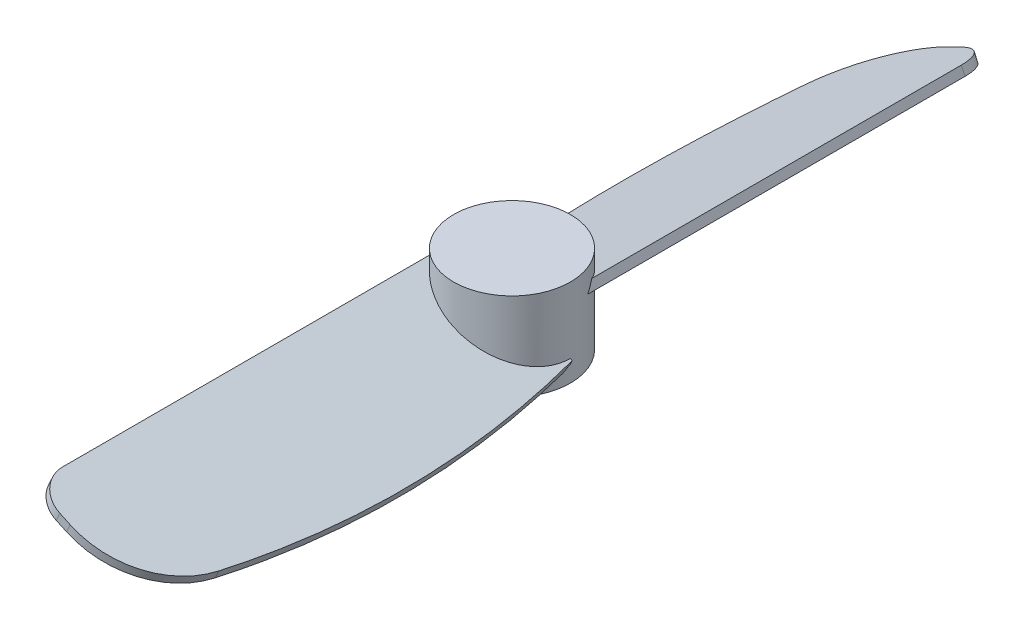
ISO-10303-21;
HEADER;
FILE_DESCRIPTION(('STEP AP214'),'2;1');
FILE_NAME('part.step','',(''),(''),'','','');
FILE_SCHEMA(('AUTOMOTIVE_DESIGN { 1 0 10303 214 1 1 1 1 }'));
ENDSEC;
DATA;
#1=APPLICATION_CONTEXT('core data for automotive mechanical design processes');
#2=APPLICATION_PROTOCOL_DEFINITION('international standard','automotive_design',2000,#1);
#3=PRODUCT_CONTEXT('',#1,'mechanical');
#4=PRODUCT('Part','Part','',(#3));
#5=PRODUCT_RELATED_PRODUCT_CATEGORY('part','',(#4));
#6=PRODUCT_DEFINITION_FORMATION('','',#4);
#7=PRODUCT_DEFINITION_CONTEXT('part definition',#1,'design');
#8=PRODUCT_DEFINITION('design','',#6,#7);
#9=PRODUCT_DEFINITION_SHAPE('','',#8);
#10=(LENGTH_UNIT() NAMED_UNIT(*) SI_UNIT(.MILLI.,.METRE.));
#11=(NAMED_UNIT(*) PLANE_ANGLE_UNIT() SI_UNIT($,.RADIAN.));
#12=(NAMED_UNIT(*) SI_UNIT($,.STERADIAN.) SOLID_ANGLE_UNIT());
#13=UNCERTAINTY_MEASURE_WITH_UNIT(LENGTH_MEASURE(1.E-05),#10,'distance_accuracy_value','');
#14=(GEOMETRIC_REPRESENTATION_CONTEXT(3) GLOBAL_UNCERTAINTY_ASSIGNED_CONTEXT((#13)) GLOBAL_UNIT_ASSIGNED_CONTEXT((#10,
#11,#12)) REPRESENTATION_CONTEXT('',''));
#15=CARTESIAN_POINT('',(0.,0.,0.));
#16=DIRECTION('',(0.,0.,1.));
#17=DIRECTION('',(1.,0.,0.));
#18=AXIS2_PLACEMENT_3D('',#15,#16,#17);
#19=CARTESIAN_POINT('',(0.,3.,0.));
#20=DIRECTION('',(0.,-1.,0.));
#21=DIRECTION('',(0.,0.,-1.));
#22=AXIS2_PLACEMENT_3D('',#19,#20,#21);
#23=CYLINDRICAL_SURFACE('',#22,2.);
#24=CARTESIAN_POINT('',(0.,1.33449331215563,0.));
#25=DIRECTION('',(0.4226182617407,0.90630778703665,0.));
#26=DIRECTION('',(0.90630778703665,-0.4226182617407,0.));
#27=AXIS2_PLACEMENT_3D('',#24,#25,#26);
#28=ELLIPSE('',#27,2.20675583792498,2.);
#29=CARTESIAN_POINT('',(-1.86168060041287,2.20260923316675,0.730852476253843));
#30=VERTEX_POINT('',#29);
#31=CARTESIAN_POINT('',(1.98470099898247,0.409012037182223,0.246904727856673));
#32=VERTEX_POINT('',#31);
#33=EDGE_CURVE('E214',#30,#32,#28,.T.);
#34=ORIENTED_EDGE('',*,*,#33,.F.);
#35=CARTESIAN_POINT('',(0.,6.19499616453053,0.));
#36=DIRECTION('',(0.90630778703665,-0.4226182617407,0.));
#37=DIRECTION('',(-0.4226182617407,-0.90630778703665,0.));
#38=AXIS2_PLACEMENT_3D('',#35,#36,#37);
#39=ELLIPSE('',#38,4.73240316630499,2.);
#40=CARTESIAN_POINT('',(-1.73489512189066,2.47450156927774,0.99505724259461));
#41=VERTEX_POINT('',#40);
#42=EDGE_CURVE('E215',#41,#30,#39,.T.);
#43=ORIENTED_EDGE('',*,*,#42,.F.);
#44=CARTESIAN_POINT('',(0.,1.66550668784437,0.));
#45=DIRECTION('',(0.4226182617407,0.90630778703665,0.));
#46=DIRECTION('',(0.90630778703665,-0.4226182617407,0.));
#47=AXIS2_PLACEMENT_3D('',#44,#45,#46);
#48=ELLIPSE('',#47,2.20675583792498,2.);
#49=CARTESIAN_POINT('',(2.,0.732891371534376,0.));
#50=VERTEX_POINT('',#49);
#51=EDGE_CURVE('E336',#41,#50,#48,.T.);
#52=ORIENTED_EDGE('',*,*,#51,.T.);
#53=DIRECTION('',(0.,-1.,0.));
#54=VECTOR('',#53,1.);
#55=CARTESIAN_POINT('',(2.,3.,0.));
#56=LINE('',#55,#54);
#57=CARTESIAN_POINT('',(2.,0.567384683689995,0.));
#58=VERTEX_POINT('',#57);
#59=EDGE_CURVE('E344',#58,#50,#56,.F.);
#60=ORIENTED_EDGE('',*,*,#59,.F.);
#61=CARTESIAN_POINT('',(1.98470099898247,0.409012037182223,0.246904727856674));
#62=CARTESIAN_POINT('',(1.98631074920114,0.418913709083716,0.233964098973606));
#63=CARTESIAN_POINT('',(1.98780866004074,0.428662089758854,0.220891180027441));
#64=CARTESIAN_POINT('',(1.99056346456721,0.447804826228146,0.194506507014765));
#65=CARTESIAN_POINT('',(1.9918208621833,0.457199888348943,0.181195317663848));
#66=CARTESIAN_POINT('',(1.99408290423281,0.475619821167752,0.154320949026741));
#67=CARTESIAN_POINT('',(1.9950878461475,0.484645116979881,0.140758086739075));
#68=CARTESIAN_POINT('',(1.99683182681587,0.502308906882166,0.113362602381722));
#69=CARTESIAN_POINT('',(1.99757082274567,0.510947338481707,0.0995299372448104));
#70=CARTESIAN_POINT('',(1.99876750219999,0.52781267297241,0.0715840387397662));
#71=CARTESIAN_POINT('',(1.99922489678712,0.536039145250494,0.0574705324864369));
#72=CARTESIAN_POINT('',(1.999841469295,0.552054847776113,0.0289482186682646));
#73=CARTESIAN_POINT('',(1.99999995161736,0.559843017327442,0.0145388009944491));
#74=CARTESIAN_POINT('',(2.,0.567384683689995,0.));
#75=B_SPLINE_CURVE_WITH_KNOTS('',3,(#61,#62,#63,#64,#65,#66,#67,#68,#69,#70,#71,#72,#73,#74),
.UNSPECIFIED.,.F.,.F.,(4,2,2,2,2,2,4),(0.,0.0491203850535244,0.0981366966215064,
0.147094975976519,0.19606113530196,0.245077453044183,0.294207696537932),.UNSPECIFIED.);
#76=EDGE_CURVE('E206',#32,#58,#75,.T.);
#77=ORIENTED_EDGE('',*,*,#76,.F.);
#78=EDGE_LOOP('',(#34,#43,#52,#60,#77));
#79=FACE_BOUND('',#78,.T.);
#80=CARTESIAN_POINT('',(0.,3.,0.));
#81=DIRECTION('',(0.,1.,0.));
#82=DIRECTION('',(0.,0.,1.));
#83=AXIS2_PLACEMENT_3D('',#80,#81,#82);
#84=CIRCLE('',#83,2.);
#85=CARTESIAN_POINT('',(0.,3.,2.));
#86=VERTEX_POINT('',#85);
#87=EDGE_CURVE('E326',#86,#86,#84,.T.);
#88=ORIENTED_EDGE('',*,*,#87,.F.);
#89=EDGE_LOOP('',(#88));
#90=FACE_BOUND('',#89,.T.);
#91=CARTESIAN_POINT('',(0.,0.,0.));
#92=DIRECTION('',(0.,1.,0.));
#93=DIRECTION('',(0.,0.,1.));
#94=AXIS2_PLACEMENT_3D('',#91,#92,#93);
#95=CIRCLE('',#94,2.);
#96=CARTESIAN_POINT('',(0.,0.,2.));
#97=VERTEX_POINT('',#96);
#98=EDGE_CURVE('E329',#97,#97,#95,.T.);
#99=ORIENTED_EDGE('',*,*,#98,.T.);
#100=EDGE_LOOP('',(#99));
#101=FACE_BOUND('',#100,.T.);
#102=CARTESIAN_POINT('',(0.,1.33449331215563,0.));
#103=DIRECTION('',(-0.4226182617407,0.90630778703665,0.));
#104=DIRECTION('',(-0.90630778703665,-0.4226182617407,0.));
#105=AXIS2_PLACEMENT_3D('',#102,#103,#104);
#106=ELLIPSE('',#105,2.20675583792498,2.);
#107=CARTESIAN_POINT('',(1.86168060041287,2.20260923316675,-0.730852476253843));
#108=VERTEX_POINT('',#107);
#109=CARTESIAN_POINT('',(-1.98470099898247,0.409012037182223,-0.246904727856673));
#110=VERTEX_POINT('',#109);
#111=EDGE_CURVE('E11',#108,#110,#106,.T.);
#112=ORIENTED_EDGE('',*,*,#111,.F.);
#113=CARTESIAN_POINT('',(0.,6.19499616453053,0.));
#114=DIRECTION('',(-0.90630778703665,-0.4226182617407,0.));
#115=DIRECTION('',(0.4226182617407,-0.90630778703665,0.));
#116=AXIS2_PLACEMENT_3D('',#113,#114,#115);
#117=ELLIPSE('',#116,4.73240316630499,2.);
#118=CARTESIAN_POINT('',(1.73489512189066,2.47450156927774,-0.99505724259461));
#119=VERTEX_POINT('',#118);
#120=EDGE_CURVE('E226',#119,#108,#117,.T.);
#121=ORIENTED_EDGE('',*,*,#120,.F.);
#122=CARTESIAN_POINT('',(0.,1.66550668784437,0.));
#123=DIRECTION('',(-0.4226182617407,0.90630778703665,0.));
#124=DIRECTION('',(-0.90630778703665,-0.4226182617407,0.));
#125=AXIS2_PLACEMENT_3D('',#122,#123,#124);
#126=ELLIPSE('',#125,2.20675583792498,2.);
#127=CARTESIAN_POINT('',(-2.,0.732891371534376,0.));
#128=VERTEX_POINT('',#127);
#129=EDGE_CURVE('E219',#119,#128,#126,.T.);
#130=ORIENTED_EDGE('',*,*,#129,.T.);
#131=DIRECTION('',(0.,-1.,0.));
#132=VECTOR('',#131,1.);
#133=CARTESIAN_POINT('',(-2.,3.,0.));
#134=LINE('',#133,#132);
#135=CARTESIAN_POINT('',(-2.,0.567384683689995,0.));
#136=VERTEX_POINT('',#135);
#137=EDGE_CURVE('E223',#136,#128,#134,.F.);
#138=ORIENTED_EDGE('',*,*,#137,.F.);
#139=CARTESIAN_POINT('',(-1.98470099898247,0.409012037182223,-0.246904727856674));
#140=CARTESIAN_POINT('',(-1.98631074920114,0.418913709083716,-0.233964098973606));
#141=CARTESIAN_POINT('',(-1.98780866004074,0.428662089758854,-0.220891180027441));
#142=CARTESIAN_POINT('',(-1.99056346456721,0.447804826228146,-0.194506507014765));
#143=CARTESIAN_POINT('',(-1.9918208621833,0.457199888348943,-0.181195317663848));
#144=CARTESIAN_POINT('',(-1.99408290423281,0.475619821167752,-0.154320949026741));
#145=CARTESIAN_POINT('',(-1.9950878461475,0.484645116979881,-0.140758086739075));
#146=CARTESIAN_POINT('',(-1.99683182681587,0.502308906882166,-0.113362602381722));
#147=CARTESIAN_POINT('',(-1.99757082274567,0.510947338481707,-0.0995299372448104));
#148=CARTESIAN_POINT('',(-1.99876750219999,0.52781267297241,-0.0715840387397662));
#149=CARTESIAN_POINT('',(-1.99922489678712,0.536039145250494,-0.0574705324864369));
#150=CARTESIAN_POINT('',(-1.999841469295,0.552054847776113,-0.0289482186682646));
#151=CARTESIAN_POINT('',(-1.99999995161736,0.559843017327442,-0.0145388009944491));
#152=CARTESIAN_POINT('',(-2.,0.567384683689995,0.));
#153=B_SPLINE_CURVE_WITH_KNOTS('',3,(#139,#140,#141,#142,#143,#144,#145,#146,#147,#148,#149,
#150,#151,#152),.UNSPECIFIED.,.F.,.F.,(4,2,2,2,2,2,4),(0.,0.0491203850535244,0.0981366966215064,
0.147094975976519,0.19606113530196,0.245077453044183,0.294207696537932),.UNSPECIFIED.);
#154=EDGE_CURVE('E52',#110,#136,#153,.T.);
#155=ORIENTED_EDGE('',*,*,#154,.F.);
#156=EDGE_LOOP('',(#112,#121,#130,#138,#155));
#157=FACE_BOUND('',#156,.T.);
#158=ADVANCED_FACE('F43',(#79,#90,#101,#157),#23,.T.);
#159=CARTESIAN_POINT('',(0.,3.,0.));
#160=DIRECTION('',(0.,1.,0.));
#161=DIRECTION('',(0.,0.,1.));
#162=AXIS2_PLACEMENT_3D('',#159,#160,#161);
#163=PLANE('',#162);
#164=ORIENTED_EDGE('',*,*,#87,.T.);
#165=EDGE_LOOP('',(#164));
#166=FACE_BOUND('',#165,.T.);
#167=ADVANCED_FACE('F204',(#166),#163,.T.);
#168=CARTESIAN_POINT('',(0.,0.,0.));
#169=DIRECTION('',(0.,1.,0.));
#170=DIRECTION('',(0.,0.,1.));
#171=AXIS2_PLACEMENT_3D('',#168,#169,#170);
#172=PLANE('',#171);
#173=ORIENTED_EDGE('',*,*,#98,.F.);
#174=EDGE_LOOP('',(#173));
#175=FACE_BOUND('',#174,.T.);
#176=ADVANCED_FACE('F200',(#175),#172,.F.);
#177=CARTESIAN_POINT('',(1.9366072607389,0.431438515634503,0.));
#178=CARTESIAN_POINT('',(2.74310536573246,0.0553622729885107,4.05925916805056));
#179=CARTESIAN_POINT('',(2.78270618295463,0.0368961086486167,8.18706439425503));
#180=CARTESIAN_POINT('',(2.06446844732065,0.371815865150648,12.2227826917002));
#181=B_SPLINE_CURVE_WITH_KNOTS('',3,(#177,#178,#179,#180),.UNSPECIFIED.,.F.,.F.,(4,4),(0.,
0.833038136070243),.UNSPECIFIED.);
#182=DIRECTION('',(0.4226182617407,0.90630778703665,0.));
#183=VECTOR('',#182,1.);
#184=SURFACE_OF_LINEAR_EXTRUSION('',#181,#183);
#185=CARTESIAN_POINT('',(2.06446844732065,0.371815865150648,12.2227826917002));
#186=VERTEX_POINT('',#185);
#187=EDGE_CURVE('E182',#32,#186,#181,.T.);
#188=ORIENTED_EDGE('',*,*,#187,.F.);
#189=ORIENTED_EDGE('',*,*,#76,.T.);
#190=DIRECTION('',(0.4226182617407,0.90630778703665,0.));
#191=VECTOR('',#190,1.);
#192=CARTESIAN_POINT('',(1.9366072607389,0.431438515634503,0.));
#193=LINE('',#192,#191);
#194=CARTESIAN_POINT('',(2.06339273926111,0.703330851745498,0.));
#195=VERTEX_POINT('',#194);
#196=EDGE_CURVE('E365',#58,#195,#193,.T.);
#197=ORIENTED_EDGE('',*,*,#196,.T.);
#198=CARTESIAN_POINT('',(2.06339273926111,0.703330851745498,0.));
#199=CARTESIAN_POINT('',(2.86989084425467,0.327254609099506,4.05925916805056));
#200=CARTESIAN_POINT('',(2.90949166147684,0.308788444759612,8.18706439425503));
#201=CARTESIAN_POINT('',(2.19125392584286,0.643708201261643,12.2227826917002));
#202=B_SPLINE_CURVE_WITH_KNOTS('',3,(#198,#199,#200,#201),.UNSPECIFIED.,.F.,.F.,(4,4),(0.,
0.833038136070243),.UNSPECIFIED.);
#203=CARTESIAN_POINT('',(2.19125392584286,0.643708201261643,12.2227826917002));
#204=VERTEX_POINT('',#203);
#205=EDGE_CURVE('E171',#195,#204,#202,.T.);
#206=ORIENTED_EDGE('',*,*,#205,.T.);
#207=DIRECTION('',(0.4226182617407,0.90630778703665,0.));
#208=VECTOR('',#207,1.);
#209=CARTESIAN_POINT('',(2.06446844732065,0.371815865150648,12.2227826917002));
#210=LINE('',#209,#208);
#211=EDGE_CURVE('E332',#186,#204,#210,.T.);
#212=ORIENTED_EDGE('',*,*,#211,.F.);
#213=EDGE_LOOP('',(#188,#189,#197,#206,#212));
#214=FACE_BOUND('',#213,.T.);
#215=ADVANCED_FACE('F194',(#214),#184,.F.);
#216=CARTESIAN_POINT('',(-1.14374465748212,1.86783020491341,0.));
#217=DIRECTION('',(0.,0.,1.));
#218=DIRECTION('',(1.,0.,0.));
#219=AXIS2_PLACEMENT_3D('',#216,#217,#218);
#220=PLANE('',#219);
#221=ORIENTED_EDGE('',*,*,#196,.F.);
#222=ORIENTED_EDGE('',*,*,#59,.T.);
#223=DIRECTION('',(0.90630778703665,-0.4226182617407,0.));
#224=VECTOR('',#223,1.);
#225=CARTESIAN_POINT('',(-1.01695917895991,2.1397225410244,0.));
#226=LINE('',#225,#224);
#227=EDGE_CURVE('E67',#50,#195,#226,.T.);
#228=ORIENTED_EDGE('',*,*,#227,.T.);
#229=EDGE_LOOP('',(#221,#222,#228));
#230=FACE_BOUND('',#229,.T.);
#231=ADVANCED_FACE('F199',(#230),#220,.F.);
#232=CARTESIAN_POINT('',(-0.603502237511158,1.61591102722076,11.6447172519861));
#233=DIRECTION('',(0.4226182617407,0.90630778703665,0.));
#234=DIRECTION('',(-0.90630778703665,0.4226182617407,0.));
#235=AXIS2_PLACEMENT_3D('',#232,#233,#234);
#236=CYLINDRICAL_SURFACE('',#235,3.);
#237=CARTESIAN_POINT('',(-0.476716758988948,1.88780336333175,11.6447172519861));
#238=DIRECTION('',(-0.4226182617407,-0.90630778703665,0.));
#239=DIRECTION('',(0.90630778703665,-0.4226182617407,0.));
#240=AXIS2_PLACEMENT_3D('',#237,#238,#239);
#241=CIRCLE('',#240,3.);
#242=CARTESIAN_POINT('',(-0.476716758988949,1.88780336333175,14.6447172519861));
#243=VERTEX_POINT('',#242);
#244=EDGE_CURVE('E176',#204,#243,#241,.T.);
#245=ORIENTED_EDGE('',*,*,#244,.T.);
#246=DIRECTION('',(0.4226182617407,0.90630778703665,0.));
#247=VECTOR('',#246,1.);
#248=CARTESIAN_POINT('',(-0.603502237511159,1.61591102722076,14.6447172519861));
#249=LINE('',#248,#247);
#250=CARTESIAN_POINT('',(-0.603502237511159,1.61591102722076,14.6447172519861));
#251=VERTEX_POINT('',#250);
#252=EDGE_CURVE('E339',#251,#243,#249,.T.);
#253=ORIENTED_EDGE('',*,*,#252,.F.);
#254=CARTESIAN_POINT('',(-0.603502237511158,1.61591102722076,11.6447172519861));
#255=DIRECTION('',(-0.4226182617407,-0.90630778703665,0.));
#256=DIRECTION('',(0.90630778703665,-0.4226182617407,0.));
#257=AXIS2_PLACEMENT_3D('',#254,#255,#256);
#258=CIRCLE('',#257,3.);
#259=EDGE_CURVE('E188',#186,#251,#258,.T.);
#260=ORIENTED_EDGE('',*,*,#259,.F.);
#261=ORIENTED_EDGE('',*,*,#211,.T.);
#262=EDGE_LOOP('',(#245,#253,#260,#261));
#263=FACE_BOUND('',#262,.T.);
#264=ADVANCED_FACE('F202',(#263),#236,.T.);
#265=CARTESIAN_POINT('',(-0.955372813376221,1.77999097142605,14.6447172519861));
#266=DIRECTION('',(0.,0.,-1.));
#267=DIRECTION('',(-1.,0.,0.));
#268=AXIS2_PLACEMENT_3D('',#265,#266,#267);
#269=PLANE('',#268);
#270=DIRECTION('',(-0.906307787036649,0.4226182617407,0.));
#271=VECTOR('',#270,1.);
#272=CARTESIAN_POINT('',(-0.828587334854011,2.05188330753704,14.6447172519861));
#273=LINE('',#272,#271);
#274=CARTESIAN_POINT('',(-0.828587334854011,2.05188330753704,14.6447172519861));
#275=VERTEX_POINT('',#274);
#276=EDGE_CURVE('E381',#243,#275,#273,.T.);
#277=ORIENTED_EDGE('',*,*,#276,.T.);
#278=DIRECTION('',(0.4226182617407,0.90630778703665,0.));
#279=VECTOR('',#278,1.);
#280=CARTESIAN_POINT('',(-0.955372813376221,1.77999097142605,14.6447172519861));
#281=LINE('',#280,#279);
#282=CARTESIAN_POINT('',(-0.955372813376221,1.77999097142605,14.6447172519861));
#283=VERTEX_POINT('',#282);
#284=EDGE_CURVE('E393',#283,#275,#281,.T.);
#285=ORIENTED_EDGE('',*,*,#284,.F.);
#286=DIRECTION('',(-0.906307787036649,0.4226182617407,0.));
#287=VECTOR('',#286,1.);
#288=CARTESIAN_POINT('',(-0.955372813376221,1.77999097142605,14.6447172519861));
#289=LINE('',#288,#287);
#290=EDGE_CURVE('E371',#251,#283,#289,.T.);
#291=ORIENTED_EDGE('',*,*,#290,.F.);
#292=ORIENTED_EDGE('',*,*,#252,.T.);
#293=EDGE_LOOP('',(#277,#285,#291,#292));
#294=FACE_BOUND('',#293,.T.);
#295=ADVANCED_FACE('F403',(#294),#269,.F.);
#296=CARTESIAN_POINT('',(-0.955372813376221,1.77999097142605,13.6447172519861));
#297=DIRECTION('',(0.4226182617407,0.90630778703665,0.));
#298=DIRECTION('',(-0.90630778703665,0.4226182617407,0.));
#299=AXIS2_PLACEMENT_3D('',#296,#297,#298);
#300=CYLINDRICAL_SURFACE('',#299,1.);
#301=CARTESIAN_POINT('',(-0.828587334854011,2.05188330753704,13.6447172519861));
#302=DIRECTION('',(-0.4226182617407,-0.90630778703665,0.));
#303=DIRECTION('',(-0.90630778703665,0.4226182617407,0.));
#304=AXIS2_PLACEMENT_3D('',#301,#302,#303);
#305=CIRCLE('',#304,1.);
#306=CARTESIAN_POINT('',(-1.73489512189066,2.47450156927774,13.6447172519861));
#307=VERTEX_POINT('',#306);
#308=EDGE_CURVE('E384',#275,#307,#305,.T.);
#309=ORIENTED_EDGE('',*,*,#308,.T.);
#310=DIRECTION('',(0.4226182617407,0.90630778703665,0.));
#311=VECTOR('',#310,1.);
#312=CARTESIAN_POINT('',(-1.86168060041287,2.20260923316675,13.6447172519861));
#313=LINE('',#312,#311);
#314=CARTESIAN_POINT('',(-1.86168060041287,2.20260923316675,13.6447172519861));
#315=VERTEX_POINT('',#314);
#316=EDGE_CURVE('E369',#315,#307,#313,.T.);
#317=ORIENTED_EDGE('',*,*,#316,.F.);
#318=CARTESIAN_POINT('',(-0.955372813376221,1.77999097142605,13.6447172519861));
#319=DIRECTION('',(-0.4226182617407,-0.90630778703665,0.));
#320=DIRECTION('',(-0.90630778703665,0.4226182617407,0.));
#321=AXIS2_PLACEMENT_3D('',#318,#319,#320);
#322=CIRCLE('',#321,1.);
#323=EDGE_CURVE('E362',#283,#315,#322,.T.);
#324=ORIENTED_EDGE('',*,*,#323,.F.);
#325=ORIENTED_EDGE('',*,*,#284,.T.);
#326=EDGE_LOOP('',(#309,#317,#324,#325));
#327=FACE_BOUND('',#326,.T.);
#328=ADVANCED_FACE('F409',(#327),#300,.T.);
#329=CARTESIAN_POINT('',(-1.86168060041287,2.20260923316675,0.610320394620634));
#330=DIRECTION('',(0.90630778703665,-0.4226182617407,0.));
#331=DIRECTION('',(0.4226182617407,0.90630778703665,0.));
#332=AXIS2_PLACEMENT_3D('',#329,#330,#331);
#333=PLANE('',#332);
#334=DIRECTION('',(0.,0.,-1.));
#335=VECTOR('',#334,1.);
#336=CARTESIAN_POINT('',(-1.73489512189066,2.47450156927774,0.610320394620634));
#337=LINE('',#336,#335);
#338=EDGE_CURVE('E358',#307,#41,#337,.T.);
#339=ORIENTED_EDGE('',*,*,#338,.T.);
#340=ORIENTED_EDGE('',*,*,#42,.T.);
#341=DIRECTION('',(0.,0.,-1.));
#342=VECTOR('',#341,1.);
#343=CARTESIAN_POINT('',(-1.86168060041287,2.20260923316675,0.610320394620634));
#344=LINE('',#343,#342);
#345=EDGE_CURVE('E356',#315,#30,#344,.T.);
#346=ORIENTED_EDGE('',*,*,#345,.F.);
#347=ORIENTED_EDGE('',*,*,#316,.T.);
#348=EDGE_LOOP('',(#339,#340,#346,#347));
#349=FACE_BOUND('',#348,.T.);
#350=ADVANCED_FACE('F354',(#349),#333,.F.);
#351=CARTESIAN_POINT('',(2.5723137942651,0.135003690712067,6.12021917232712));
#352=DIRECTION('',(0.4226182617407,0.90630778703665,0.));
#353=DIRECTION('',(-0.90630778703665,0.4226182617407,0.));
#354=AXIS2_PLACEMENT_3D('',#351,#352,#353);
#355=PLANE('',#354);
#356=ORIENTED_EDGE('',*,*,#345,.T.);
#357=ORIENTED_EDGE('',*,*,#33,.T.);
#358=ORIENTED_EDGE('',*,*,#187,.T.);
#359=ORIENTED_EDGE('',*,*,#259,.T.);
#360=ORIENTED_EDGE('',*,*,#290,.T.);
#361=ORIENTED_EDGE('',*,*,#323,.T.);
#362=EDGE_LOOP('',(#356,#357,#358,#359,#360,#361));
#363=FACE_BOUND('',#362,.T.);
#364=ADVANCED_FACE('F241',(#363),#355,.F.);
#365=CARTESIAN_POINT('',(2.69909927278731,0.406896026823062,6.12021917232712));
#366=DIRECTION('',(0.4226182617407,0.90630778703665,0.));
#367=DIRECTION('',(-0.90630778703665,0.4226182617407,0.));
#368=AXIS2_PLACEMENT_3D('',#365,#366,#367);
#369=PLANE('',#368);
#370=ORIENTED_EDGE('',*,*,#51,.F.);
#371=ORIENTED_EDGE('',*,*,#338,.F.);
#372=ORIENTED_EDGE('',*,*,#308,.F.);
#373=ORIENTED_EDGE('',*,*,#276,.F.);
#374=ORIENTED_EDGE('',*,*,#244,.F.);
#375=ORIENTED_EDGE('',*,*,#205,.F.);
#376=ORIENTED_EDGE('',*,*,#227,.F.);
#377=EDGE_LOOP('',(#370,#371,#372,#373,#374,#375,#376));
#378=FACE_BOUND('',#377,.T.);
#379=ADVANCED_FACE('F239',(#378),#369,.T.);
#380=CARTESIAN_POINT('',(-1.9366072607389,0.431438515634503,0.));
#381=CARTESIAN_POINT('',(-2.74310536573246,0.0553622729885107,-4.05925916805056));
#382=CARTESIAN_POINT('',(-2.78270618295463,0.0368961086486167,-8.18706439425503));
#383=CARTESIAN_POINT('',(-2.06446844732065,0.371815865150648,-12.2227826917002));
#384=B_SPLINE_CURVE_WITH_KNOTS('',3,(#380,#381,#382,#383),.UNSPECIFIED.,.F.,.F.,(4,4),(0.,
0.833038136070243),.UNSPECIFIED.);
#385=DIRECTION('',(-0.4226182617407,0.90630778703665,0.));
#386=VECTOR('',#385,1.);
#387=SURFACE_OF_LINEAR_EXTRUSION('',#384,#386);
#388=CARTESIAN_POINT('',(-2.06446844732065,0.371815865150648,-12.2227826917002));
#389=VERTEX_POINT('',#388);
#390=EDGE_CURVE('E145',#110,#389,#384,.T.);
#391=ORIENTED_EDGE('',*,*,#390,.F.);
#392=ORIENTED_EDGE('',*,*,#154,.T.);
#393=DIRECTION('',(-0.4226182617407,0.90630778703665,0.));
#394=VECTOR('',#393,1.);
#395=CARTESIAN_POINT('',(-1.9366072607389,0.431438515634503,0.));
#396=LINE('',#395,#394);
#397=CARTESIAN_POINT('',(-2.06339273926111,0.703330851745498,0.));
#398=VERTEX_POINT('',#397);
#399=EDGE_CURVE('E258',#136,#398,#396,.T.);
#400=ORIENTED_EDGE('',*,*,#399,.T.);
#401=CARTESIAN_POINT('',(-2.06339273926111,0.703330851745498,0.));
#402=CARTESIAN_POINT('',(-2.86989084425467,0.327254609099506,-4.05925916805056));
#403=CARTESIAN_POINT('',(-2.90949166147684,0.308788444759612,-8.18706439425503));
#404=CARTESIAN_POINT('',(-2.19125392584286,0.643708201261643,-12.2227826917002));
#405=B_SPLINE_CURVE_WITH_KNOTS('',3,(#401,#402,#403,#404),.UNSPECIFIED.,.F.,.F.,(4,4),(0.,
0.833038136070243),.UNSPECIFIED.);
#406=CARTESIAN_POINT('',(-2.19125392584286,0.643708201261643,-12.2227826917002));
#407=VERTEX_POINT('',#406);
#408=EDGE_CURVE('E169',#398,#407,#405,.T.);
#409=ORIENTED_EDGE('',*,*,#408,.T.);
#410=DIRECTION('',(-0.4226182617407,0.90630778703665,0.));
#411=VECTOR('',#410,1.);
#412=CARTESIAN_POINT('',(-2.06446844732065,0.371815865150648,-12.2227826917002));
#413=LINE('',#412,#411);
#414=EDGE_CURVE('E160',#389,#407,#413,.T.);
#415=ORIENTED_EDGE('',*,*,#414,.F.);
#416=EDGE_LOOP('',(#391,#392,#400,#409,#415));
#417=FACE_BOUND('',#416,.T.);
#418=ADVANCED_FACE('F168',(#417),#387,.F.);
#419=CARTESIAN_POINT('',(1.14374465748212,1.86783020491341,0.));
#420=DIRECTION('',(0.,0.,-1.));
#421=DIRECTION('',(-1.,0.,0.));
#422=AXIS2_PLACEMENT_3D('',#419,#420,#421);
#423=PLANE('',#422);
#424=ORIENTED_EDGE('',*,*,#399,.F.);
#425=ORIENTED_EDGE('',*,*,#137,.T.);
#426=DIRECTION('',(-0.90630778703665,-0.4226182617407,0.));
#427=VECTOR('',#426,1.);
#428=CARTESIAN_POINT('',(1.01695917895991,2.1397225410244,0.));
#429=LINE('',#428,#427);
#430=EDGE_CURVE('E59',#128,#398,#429,.T.);
#431=ORIENTED_EDGE('',*,*,#430,.T.);
#432=EDGE_LOOP('',(#424,#425,#431));
#433=FACE_BOUND('',#432,.T.);
#434=ADVANCED_FACE('F238',(#433),#423,.F.);
#435=CARTESIAN_POINT('',(0.603502237511158,1.61591102722076,-11.6447172519861));
#436=DIRECTION('',(-0.4226182617407,0.90630778703665,0.));
#437=DIRECTION('',(-0.90630778703665,-0.4226182617407,0.));
#438=AXIS2_PLACEMENT_3D('',#435,#436,#437);
#439=CYLINDRICAL_SURFACE('',#438,3.);
#440=CARTESIAN_POINT('',(0.476716758988948,1.88780336333175,-11.6447172519861));
#441=DIRECTION('',(0.4226182617407,-0.90630778703665,0.));
#442=DIRECTION('',(-0.90630778703665,-0.4226182617407,0.));
#443=AXIS2_PLACEMENT_3D('',#440,#441,#442);
#444=CIRCLE('',#443,3.);
#445=CARTESIAN_POINT('',(0.476716758988949,1.88780336333175,-14.6447172519861));
#446=VERTEX_POINT('',#445);
#447=EDGE_CURVE('E263',#407,#446,#444,.T.);
#448=ORIENTED_EDGE('',*,*,#447,.T.);
#449=DIRECTION('',(-0.4226182617407,0.90630778703665,0.));
#450=VECTOR('',#449,1.);
#451=CARTESIAN_POINT('',(0.603502237511159,1.61591102722076,-14.6447172519861));
#452=LINE('',#451,#450);
#453=CARTESIAN_POINT('',(0.603502237511159,1.61591102722076,-14.6447172519861));
#454=VERTEX_POINT('',#453);
#455=EDGE_CURVE('E163',#454,#446,#452,.T.);
#456=ORIENTED_EDGE('',*,*,#455,.F.);
#457=CARTESIAN_POINT('',(0.603502237511158,1.61591102722076,-11.6447172519861));
#458=DIRECTION('',(0.4226182617407,-0.90630778703665,0.));
#459=DIRECTION('',(-0.90630778703665,-0.4226182617407,0.));
#460=AXIS2_PLACEMENT_3D('',#457,#458,#459);
#461=CIRCLE('',#460,3.);
#462=EDGE_CURVE('E149',#389,#454,#461,.T.);
#463=ORIENTED_EDGE('',*,*,#462,.F.);
#464=ORIENTED_EDGE('',*,*,#414,.T.);
#465=EDGE_LOOP('',(#448,#456,#463,#464));
#466=FACE_BOUND('',#465,.T.);
#467=ADVANCED_FACE('F159',(#466),#439,.T.);
#468=CARTESIAN_POINT('',(0.955372813376221,1.77999097142605,-14.6447172519861));
#469=DIRECTION('',(0.,0.,1.));
#470=DIRECTION('',(1.,0.,0.));
#471=AXIS2_PLACEMENT_3D('',#468,#469,#470);
#472=PLANE('',#471);
#473=DIRECTION('',(0.906307787036649,0.4226182617407,0.));
#474=VECTOR('',#473,1.);
#475=CARTESIAN_POINT('',(0.828587334854011,2.05188330753704,-14.6447172519861));
#476=LINE('',#475,#474);
#477=CARTESIAN_POINT('',(0.828587334854011,2.05188330753704,-14.6447172519861));
#478=VERTEX_POINT('',#477);
#479=EDGE_CURVE('E269',#446,#478,#476,.T.);
#480=ORIENTED_EDGE('',*,*,#479,.T.);
#481=DIRECTION('',(-0.4226182617407,0.90630778703665,0.));
#482=VECTOR('',#481,1.);
#483=CARTESIAN_POINT('',(0.955372813376221,1.77999097142605,-14.6447172519861));
#484=LINE('',#483,#482);
#485=CARTESIAN_POINT('',(0.955372813376221,1.77999097142605,-14.6447172519861));
#486=VERTEX_POINT('',#485);
#487=EDGE_CURVE('E178',#486,#478,#484,.T.);
#488=ORIENTED_EDGE('',*,*,#487,.F.);
#489=DIRECTION('',(0.906307787036649,0.4226182617407,0.));
#490=VECTOR('',#489,1.);
#491=CARTESIAN_POINT('',(0.955372813376221,1.77999097142605,-14.6447172519861));
#492=LINE('',#491,#490);
#493=EDGE_CURVE('E166',#454,#486,#492,.T.);
#494=ORIENTED_EDGE('',*,*,#493,.F.);
#495=ORIENTED_EDGE('',*,*,#455,.T.);
#496=EDGE_LOOP('',(#480,#488,#494,#495));
#497=FACE_BOUND('',#496,.T.);
#498=ADVANCED_FACE('F306',(#497),#472,.F.);
#499=CARTESIAN_POINT('',(0.955372813376221,1.77999097142605,-13.6447172519861));
#500=DIRECTION('',(-0.4226182617407,0.90630778703665,0.));
#501=DIRECTION('',(-0.90630778703665,-0.4226182617407,0.));
#502=AXIS2_PLACEMENT_3D('',#499,#500,#501);
#503=CYLINDRICAL_SURFACE('',#502,1.);
#504=CARTESIAN_POINT('',(0.828587334854011,2.05188330753704,-13.6447172519861));
#505=DIRECTION('',(0.4226182617407,-0.90630778703665,0.));
#506=DIRECTION('',(0.90630778703665,0.4226182617407,0.));
#507=AXIS2_PLACEMENT_3D('',#504,#505,#506);
#508=CIRCLE('',#507,1.);
#509=CARTESIAN_POINT('',(1.73489512189066,2.47450156927774,-13.6447172519861));
#510=VERTEX_POINT('',#509);
#511=EDGE_CURVE('E272',#478,#510,#508,.T.);
#512=ORIENTED_EDGE('',*,*,#511,.T.);
#513=DIRECTION('',(-0.4226182617407,0.90630778703665,0.));
#514=VECTOR('',#513,1.);
#515=CARTESIAN_POINT('',(1.86168060041287,2.20260923316675,-13.6447172519861));
#516=LINE('',#515,#514);
#517=CARTESIAN_POINT('',(1.86168060041287,2.20260923316675,-13.6447172519861));
#518=VERTEX_POINT('',#517);
#519=EDGE_CURVE('E283',#518,#510,#516,.T.);
#520=ORIENTED_EDGE('',*,*,#519,.F.);
#521=CARTESIAN_POINT('',(0.955372813376221,1.77999097142605,-13.6447172519861));
#522=DIRECTION('',(0.4226182617407,-0.90630778703665,0.));
#523=DIRECTION('',(0.90630778703665,0.4226182617407,0.));
#524=AXIS2_PLACEMENT_3D('',#521,#522,#523);
#525=CIRCLE('',#524,1.);
#526=EDGE_CURVE('E252',#486,#518,#525,.T.);
#527=ORIENTED_EDGE('',*,*,#526,.F.);
#528=ORIENTED_EDGE('',*,*,#487,.T.);
#529=EDGE_LOOP('',(#512,#520,#527,#528));
#530=FACE_BOUND('',#529,.T.);
#531=ADVANCED_FACE('F292',(#530),#503,.T.);
#532=CARTESIAN_POINT('',(1.86168060041287,2.20260923316675,-0.610320394620634));
#533=DIRECTION('',(-0.90630778703665,-0.4226182617407,0.));
#534=DIRECTION('',(0.4226182617407,-0.90630778703665,0.));
#535=AXIS2_PLACEMENT_3D('',#532,#533,#534);
#536=PLANE('',#535);
#537=DIRECTION('',(0.,0.,1.));
#538=VECTOR('',#537,1.);
#539=CARTESIAN_POINT('',(1.73489512189066,2.47450156927774,-0.610320394620634));
#540=LINE('',#539,#538);
#541=EDGE_CURVE('E275',#510,#119,#540,.T.);
#542=ORIENTED_EDGE('',*,*,#541,.T.);
#543=ORIENTED_EDGE('',*,*,#120,.T.);
#544=DIRECTION('',(0.,0.,1.));
#545=VECTOR('',#544,1.);
#546=CARTESIAN_POINT('',(1.86168060041287,2.20260923316675,-0.610320394620634));
#547=LINE('',#546,#545);
#548=EDGE_CURVE('E255',#518,#108,#547,.T.);
#549=ORIENTED_EDGE('',*,*,#548,.F.);
#550=ORIENTED_EDGE('',*,*,#519,.T.);
#551=EDGE_LOOP('',(#542,#543,#549,#550));
#552=FACE_BOUND('',#551,.T.);
#553=ADVANCED_FACE('F300',(#552),#536,.F.);
#554=CARTESIAN_POINT('',(-2.5723137942651,0.135003690712067,-6.12021917232712));
#555=DIRECTION('',(-0.4226182617407,0.90630778703665,0.));
#556=DIRECTION('',(0.90630778703665,0.4226182617407,0.));
#557=AXIS2_PLACEMENT_3D('',#554,#555,#556);
#558=PLANE('',#557);
#559=ORIENTED_EDGE('',*,*,#548,.T.);
#560=ORIENTED_EDGE('',*,*,#111,.T.);
#561=ORIENTED_EDGE('',*,*,#390,.T.);
#562=ORIENTED_EDGE('',*,*,#462,.T.);
#563=ORIENTED_EDGE('',*,*,#493,.T.);
#564=ORIENTED_EDGE('',*,*,#526,.T.);
#565=EDGE_LOOP('',(#559,#560,#561,#562,#563,#564));
#566=FACE_BOUND('',#565,.T.);
#567=ADVANCED_FACE('F148',(#566),#558,.F.);
#568=CARTESIAN_POINT('',(-2.69909927278731,0.406896026823062,-6.12021917232712));
#569=DIRECTION('',(-0.4226182617407,0.90630778703665,0.));
#570=DIRECTION('',(0.90630778703665,0.4226182617407,0.));
#571=AXIS2_PLACEMENT_3D('',#568,#569,#570);
#572=PLANE('',#571);
#573=ORIENTED_EDGE('',*,*,#129,.F.);
#574=ORIENTED_EDGE('',*,*,#541,.F.);
#575=ORIENTED_EDGE('',*,*,#511,.F.);
#576=ORIENTED_EDGE('',*,*,#479,.F.);
#577=ORIENTED_EDGE('',*,*,#447,.F.);
#578=ORIENTED_EDGE('',*,*,#408,.F.);
#579=ORIENTED_EDGE('',*,*,#430,.F.);
#580=EDGE_LOOP('',(#573,#574,#575,#576,#577,#578,#579));
#581=FACE_BOUND('',#580,.T.);
#582=ADVANCED_FACE('F297',(#581),#572,.T.);
#583=CLOSED_SHELL('',(#158,#167,#176,#215,#231,#264,#295,#328,#350,#364,#379,#418,#434,#467,
#498,#531,#553,#567,#582));
#584=MANIFOLD_SOLID_BREP('B2',#583);
#585=ADVANCED_BREP_SHAPE_REPRESENTATION('',(#18,#584),#14);
#586=SHAPE_DEFINITION_REPRESENTATION(#9,#585);
ENDSEC;
END-ISO-10303-21;
